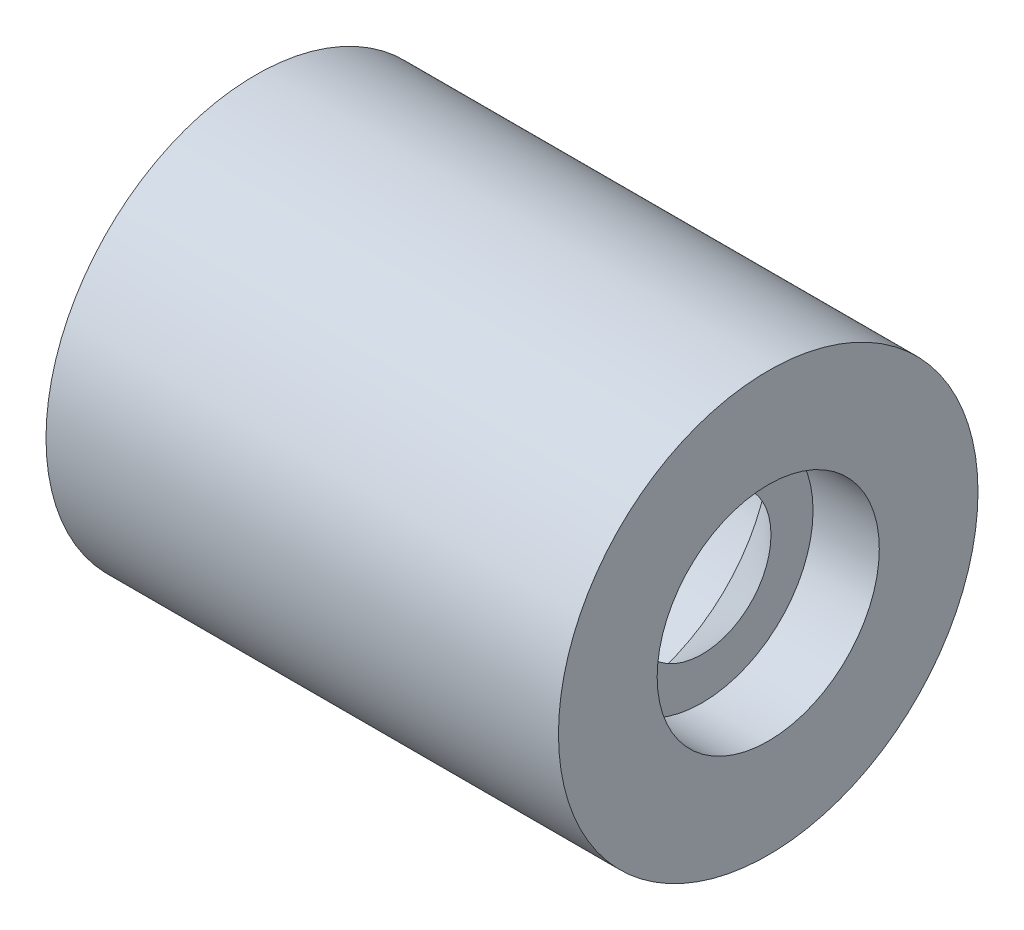
ISO-10303-21;
HEADER;
FILE_DESCRIPTION(('STEP AP214'),'2;1');
FILE_NAME('part.step','',(''),(''),'','','');
FILE_SCHEMA(('AUTOMOTIVE_DESIGN { 1 0 10303 214 1 1 1 1 }'));
ENDSEC;
DATA;
#1=APPLICATION_CONTEXT('core data for automotive mechanical design processes');
#2=APPLICATION_PROTOCOL_DEFINITION('international standard','automotive_design',2000,#1);
#3=PRODUCT_CONTEXT('',#1,'mechanical');
#4=PRODUCT('Part','Part','',(#3));
#5=PRODUCT_RELATED_PRODUCT_CATEGORY('part','',(#4));
#6=PRODUCT_DEFINITION_FORMATION('','',#4);
#7=PRODUCT_DEFINITION_CONTEXT('part definition',#1,'design');
#8=PRODUCT_DEFINITION('design','',#6,#7);
#9=PRODUCT_DEFINITION_SHAPE('','',#8);
#10=(LENGTH_UNIT() NAMED_UNIT(*) SI_UNIT(.MILLI.,.METRE.));
#11=(NAMED_UNIT(*) PLANE_ANGLE_UNIT() SI_UNIT($,.RADIAN.));
#12=(NAMED_UNIT(*) SI_UNIT($,.STERADIAN.) SOLID_ANGLE_UNIT());
#13=UNCERTAINTY_MEASURE_WITH_UNIT(LENGTH_MEASURE(1.E-05),#10,'distance_accuracy_value','');
#14=(GEOMETRIC_REPRESENTATION_CONTEXT(3) GLOBAL_UNCERTAINTY_ASSIGNED_CONTEXT((#13)) GLOBAL_UNIT_ASSIGNED_CONTEXT((#10,
#11,#12)) REPRESENTATION_CONTEXT('',''));
#15=CARTESIAN_POINT('',(0.,0.,0.));
#16=DIRECTION('',(0.,0.,1.));
#17=DIRECTION('',(1.,0.,0.));
#18=AXIS2_PLACEMENT_3D('',#15,#16,#17);
#19=CARTESIAN_POINT('',(-57.15,24.13,0.));
#20=DIRECTION('',(-1.,0.,0.));
#21=DIRECTION('',(0.,0.,1.));
#22=AXIS2_PLACEMENT_3D('',#19,#20,#21);
#23=PLANE('',#22);
#24=CARTESIAN_POINT('',(-57.15,0.,0.));
#25=DIRECTION('',(1.,0.,0.));
#26=DIRECTION('',(0.,0.,-1.));
#27=AXIS2_PLACEMENT_3D('',#24,#25,#26);
#28=CIRCLE('',#27,17.78);
#29=CARTESIAN_POINT('',(-57.15,0.,-17.78));
#30=VERTEX_POINT('',#29);
#31=EDGE_CURVE('E10',#30,#30,#28,.T.);
#32=ORIENTED_EDGE('',*,*,#31,.T.);
#33=EDGE_LOOP('',(#32));
#34=FACE_BOUND('',#33,.T.);
#35=CARTESIAN_POINT('',(-57.15,0.,0.));
#36=DIRECTION('',(1.,0.,0.));
#37=DIRECTION('',(0.,0.,-1.));
#38=AXIS2_PLACEMENT_3D('',#35,#36,#37);
#39=CIRCLE('',#38,24.13);
#40=CARTESIAN_POINT('',(-57.15,0.,-24.13));
#41=VERTEX_POINT('',#40);
#42=EDGE_CURVE('E62',#41,#41,#39,.T.);
#43=ORIENTED_EDGE('',*,*,#42,.F.);
#44=EDGE_LOOP('',(#43));
#45=FACE_BOUND('',#44,.T.);
#46=ADVANCED_FACE('F37',(#34,#45),#23,.T.);
#47=CARTESIAN_POINT('',(24.17211464598,0.,0.));
#48=DIRECTION('',(1.,0.,0.));
#49=DIRECTION('',(0.,0.,-1.));
#50=AXIS2_PLACEMENT_3D('',#47,#48,#49);
#51=CYLINDRICAL_SURFACE('',#50,17.78);
#52=CARTESIAN_POINT('',(-15.6638730333181,0.,0.));
#53=DIRECTION('',(1.,0.,0.));
#54=DIRECTION('',(0.,0.,-1.));
#55=AXIS2_PLACEMENT_3D('',#52,#53,#54);
#56=CIRCLE('',#55,17.78);
#57=CARTESIAN_POINT('',(-15.6638730333181,0.,-17.78));
#58=VERTEX_POINT('',#57);
#59=EDGE_CURVE('E43',#58,#58,#56,.T.);
#60=ORIENTED_EDGE('',*,*,#59,.T.);
#61=EDGE_LOOP('',(#60));
#62=FACE_BOUND('',#61,.T.);
#63=ORIENTED_EDGE('',*,*,#31,.F.);
#64=EDGE_LOOP('',(#63));
#65=FACE_BOUND('',#64,.T.);
#66=ADVANCED_FACE('F70',(#62,#65),#51,.F.);
#67=CARTESIAN_POINT('',(-15.6638730333181,0.,0.));
#68=DIRECTION('',(-1.,0.,0.));
#69=DIRECTION('',(0.,0.,1.));
#70=AXIS2_PLACEMENT_3D('',#67,#68,#69);
#71=CONICAL_SURFACE('',#70,17.78,0.785398163397443);
#72=CARTESIAN_POINT('',(-5.82137303331799,0.,0.));
#73=DIRECTION('',(1.,0.,0.));
#74=DIRECTION('',(0.,0.,-1.));
#75=AXIS2_PLACEMENT_3D('',#72,#73,#74);
#76=CIRCLE('',#75,7.9375);
#77=CARTESIAN_POINT('',(-5.82137303331799,0.,-7.9375));
#78=VERTEX_POINT('',#77);
#79=EDGE_CURVE('E47',#78,#78,#76,.T.);
#80=ORIENTED_EDGE('',*,*,#79,.T.);
#81=EDGE_LOOP('',(#80));
#82=FACE_BOUND('',#81,.T.);
#83=ORIENTED_EDGE('',*,*,#59,.F.);
#84=EDGE_LOOP('',(#83));
#85=FACE_BOUND('',#84,.T.);
#86=ADVANCED_FACE('F74',(#82,#85),#71,.F.);
#87=CARTESIAN_POINT('',(-5.82137303331799,7.9375,0.));
#88=DIRECTION('',(1.,0.,0.));
#89=DIRECTION('',(0.,0.,-1.));
#90=AXIS2_PLACEMENT_3D('',#87,#88,#89);
#91=PLANE('',#90);
#92=CARTESIAN_POINT('',(-5.82137303331799,0.,0.));
#93=DIRECTION('',(1.,0.,0.));
#94=DIRECTION('',(0.,0.,-1.));
#95=AXIS2_PLACEMENT_3D('',#92,#93,#94);
#96=CIRCLE('',#95,12.7762);
#97=CARTESIAN_POINT('',(-5.82137303331799,0.,-12.7762));
#98=VERTEX_POINT('',#97);
#99=EDGE_CURVE('E51',#98,#98,#96,.T.);
#100=ORIENTED_EDGE('',*,*,#99,.T.);
#101=EDGE_LOOP('',(#100));
#102=FACE_BOUND('',#101,.T.);
#103=ORIENTED_EDGE('',*,*,#79,.F.);
#104=EDGE_LOOP('',(#103));
#105=FACE_BOUND('',#104,.T.);
#106=ADVANCED_FACE('F78',(#102,#105),#91,.T.);
#107=CARTESIAN_POINT('',(24.17211464598,0.,0.));
#108=DIRECTION('',(1.,0.,0.));
#109=DIRECTION('',(0.,0.,-1.));
#110=AXIS2_PLACEMENT_3D('',#107,#108,#109);
#111=CYLINDRICAL_SURFACE('',#110,12.7762);
#112=CARTESIAN_POINT('',(1.79862696668201,0.,0.));
#113=DIRECTION('',(1.,0.,0.));
#114=DIRECTION('',(0.,0.,-1.));
#115=AXIS2_PLACEMENT_3D('',#112,#113,#114);
#116=CIRCLE('',#115,12.7762);
#117=CARTESIAN_POINT('',(1.79862696668201,0.,-12.7762));
#118=VERTEX_POINT('',#117);
#119=EDGE_CURVE('E56',#118,#118,#116,.T.);
#120=ORIENTED_EDGE('',*,*,#119,.T.);
#121=EDGE_LOOP('',(#120));
#122=FACE_BOUND('',#121,.T.);
#123=ORIENTED_EDGE('',*,*,#99,.F.);
#124=EDGE_LOOP('',(#123));
#125=FACE_BOUND('',#124,.T.);
#126=ADVANCED_FACE('F85',(#122,#125),#111,.F.);
#127=CARTESIAN_POINT('',(1.79862696668201,12.7762,0.));
#128=DIRECTION('',(1.,0.,0.));
#129=DIRECTION('',(0.,0.,-1.));
#130=AXIS2_PLACEMENT_3D('',#127,#128,#129);
#131=PLANE('',#130);
#132=CARTESIAN_POINT('',(1.79862696668201,0.,0.));
#133=DIRECTION('',(1.,0.,0.));
#134=DIRECTION('',(0.,0.,-1.));
#135=AXIS2_PLACEMENT_3D('',#132,#133,#134);
#136=CIRCLE('',#135,24.13);
#137=CARTESIAN_POINT('',(1.79862696668201,0.,-24.13));
#138=VERTEX_POINT('',#137);
#139=EDGE_CURVE('E59',#138,#138,#136,.T.);
#140=ORIENTED_EDGE('',*,*,#139,.T.);
#141=EDGE_LOOP('',(#140));
#142=FACE_BOUND('',#141,.T.);
#143=ORIENTED_EDGE('',*,*,#119,.F.);
#144=EDGE_LOOP('',(#143));
#145=FACE_BOUND('',#144,.T.);
#146=ADVANCED_FACE('F89',(#142,#145),#131,.T.);
#147=CARTESIAN_POINT('',(24.17211464598,0.,0.));
#148=DIRECTION('',(1.,0.,0.));
#149=DIRECTION('',(0.,0.,-1.));
#150=AXIS2_PLACEMENT_3D('',#147,#148,#149);
#151=CYLINDRICAL_SURFACE('',#150,24.13);
#152=ORIENTED_EDGE('',*,*,#42,.T.);
#153=EDGE_LOOP('',(#152));
#154=FACE_BOUND('',#153,.T.);
#155=ORIENTED_EDGE('',*,*,#139,.F.);
#156=EDGE_LOOP('',(#155));
#157=FACE_BOUND('',#156,.T.);
#158=ADVANCED_FACE('F66',(#154,#157),#151,.T.);
#159=CLOSED_SHELL('',(#46,#66,#86,#106,#126,#146,#158));
#160=MANIFOLD_SOLID_BREP('B2',#159);
#161=ADVANCED_BREP_SHAPE_REPRESENTATION('',(#18,#160),#14);
#162=SHAPE_DEFINITION_REPRESENTATION(#9,#161);
ENDSEC;
END-ISO-10303-21;
